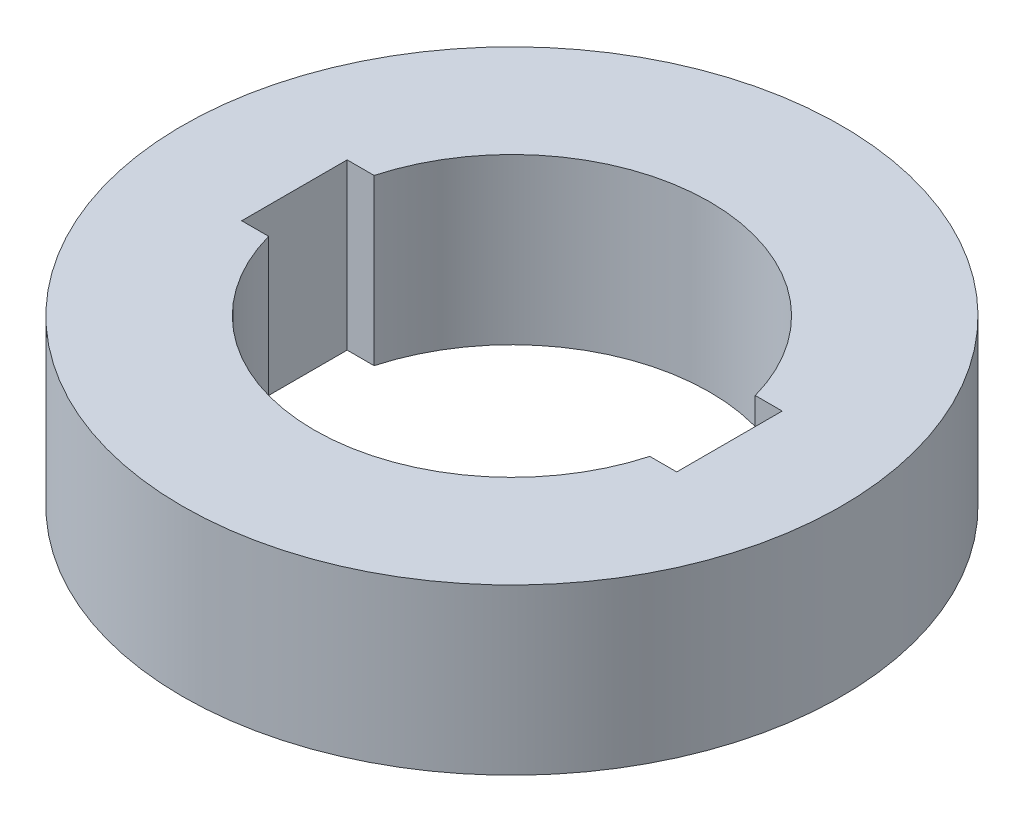
ISO-10303-21;
HEADER;
FILE_DESCRIPTION(('STEP AP214'),'2;1');
FILE_NAME('part.step','',(''),(''),'','','');
FILE_SCHEMA(('AUTOMOTIVE_DESIGN { 1 0 10303 214 1 1 1 1 }'));
ENDSEC;
DATA;
#1=APPLICATION_CONTEXT('core data for automotive mechanical design processes');
#2=APPLICATION_PROTOCOL_DEFINITION('international standard','automotive_design',2000,#1);
#3=PRODUCT_CONTEXT('',#1,'mechanical');
#4=PRODUCT('Part','Part','',(#3));
#5=PRODUCT_RELATED_PRODUCT_CATEGORY('part','',(#4));
#6=PRODUCT_DEFINITION_FORMATION('','',#4);
#7=PRODUCT_DEFINITION_CONTEXT('part definition',#1,'design');
#8=PRODUCT_DEFINITION('design','',#6,#7);
#9=PRODUCT_DEFINITION_SHAPE('','',#8);
#10=(LENGTH_UNIT() NAMED_UNIT(*) SI_UNIT(.MILLI.,.METRE.));
#11=(NAMED_UNIT(*) PLANE_ANGLE_UNIT() SI_UNIT($,.RADIAN.));
#12=(NAMED_UNIT(*) SI_UNIT($,.STERADIAN.) SOLID_ANGLE_UNIT());
#13=UNCERTAINTY_MEASURE_WITH_UNIT(LENGTH_MEASURE(1.E-05),#10,'distance_accuracy_value','');
#14=(GEOMETRIC_REPRESENTATION_CONTEXT(3) GLOBAL_UNCERTAINTY_ASSIGNED_CONTEXT((#13)) GLOBAL_UNIT_ASSIGNED_CONTEXT((#10,
#11,#12)) REPRESENTATION_CONTEXT('',''));
#15=CARTESIAN_POINT('',(0.,0.,0.));
#16=DIRECTION('',(0.,0.,1.));
#17=DIRECTION('',(1.,0.,0.));
#18=AXIS2_PLACEMENT_3D('',#15,#16,#17);
#19=CARTESIAN_POINT('',(0.,25.,0.));
#20=DIRECTION('',(0.,-1.,0.));
#21=DIRECTION('',(0.,0.,-1.));
#22=AXIS2_PLACEMENT_3D('',#19,#20,#21);
#23=CYLINDRICAL_SURFACE('',#22,50.);
#24=CARTESIAN_POINT('',(0.,25.,0.));
#25=DIRECTION('',(0.,1.,0.));
#26=DIRECTION('',(0.,0.,1.));
#27=AXIS2_PLACEMENT_3D('',#24,#25,#26);
#28=CIRCLE('',#27,50.);
#29=CARTESIAN_POINT('',(0.,25.,50.));
#30=VERTEX_POINT('',#29);
#31=EDGE_CURVE('E11',#30,#30,#28,.T.);
#32=ORIENTED_EDGE('',*,*,#31,.F.);
#33=EDGE_LOOP('',(#32));
#34=FACE_BOUND('',#33,.T.);
#35=CARTESIAN_POINT('',(0.,0.,0.));
#36=DIRECTION('',(0.,1.,0.));
#37=DIRECTION('',(0.,0.,1.));
#38=AXIS2_PLACEMENT_3D('',#35,#36,#37);
#39=CIRCLE('',#38,50.);
#40=CARTESIAN_POINT('',(0.,0.,50.));
#41=VERTEX_POINT('',#40);
#42=EDGE_CURVE('E42',#41,#41,#39,.T.);
#43=ORIENTED_EDGE('',*,*,#42,.T.);
#44=EDGE_LOOP('',(#43));
#45=FACE_BOUND('',#44,.T.);
#46=ADVANCED_FACE('F39',(#34,#45),#23,.T.);
#47=CARTESIAN_POINT('',(0.,25.,0.));
#48=DIRECTION('',(0.,1.,0.));
#49=DIRECTION('',(0.,0.,1.));
#50=AXIS2_PLACEMENT_3D('',#47,#48,#49);
#51=PLANE('',#50);
#52=CARTESIAN_POINT('',(0.,25.,0.));
#53=DIRECTION('',(0.,1.,0.));
#54=DIRECTION('',(0.,0.,1.));
#55=AXIS2_PLACEMENT_3D('',#52,#53,#54);
#56=CIRCLE('',#55,30.);
#57=CARTESIAN_POINT('',(28.9136645896019,25.,-8.));
#58=VERTEX_POINT('',#57);
#59=CARTESIAN_POINT('',(-28.9136645896019,25.,-7.99999999999999));
#60=VERTEX_POINT('',#59);
#61=EDGE_CURVE('E53',#58,#60,#56,.T.);
#62=ORIENTED_EDGE('',*,*,#61,.F.);
#63=DIRECTION('',(-1.,0.,0.));
#64=VECTOR('',#63,1.);
#65=CARTESIAN_POINT('',(33.,25.,-8.));
#66=LINE('',#65,#64);
#67=CARTESIAN_POINT('',(33.,25.,-8.));
#68=VERTEX_POINT('',#67);
#69=EDGE_CURVE('E122',#68,#58,#66,.T.);
#70=ORIENTED_EDGE('',*,*,#69,.F.);
#71=DIRECTION('',(0.,0.,-1.));
#72=VECTOR('',#71,1.);
#73=CARTESIAN_POINT('',(33.,25.,-8.));
#74=LINE('',#73,#72);
#75=CARTESIAN_POINT('',(33.,25.,8.));
#76=VERTEX_POINT('',#75);
#77=EDGE_CURVE('E125',#76,#68,#74,.T.);
#78=ORIENTED_EDGE('',*,*,#77,.F.);
#79=DIRECTION('',(1.,0.,0.));
#80=VECTOR('',#79,1.);
#81=CARTESIAN_POINT('',(33.,25.,8.));
#82=LINE('',#81,#80);
#83=CARTESIAN_POINT('',(28.9136645896019,25.,8.));
#84=VERTEX_POINT('',#83);
#85=EDGE_CURVE('E153',#84,#76,#82,.T.);
#86=ORIENTED_EDGE('',*,*,#85,.F.);
#87=CARTESIAN_POINT('',(0.,25.,0.));
#88=DIRECTION('',(0.,1.,0.));
#89=DIRECTION('',(0.,0.,1.));
#90=AXIS2_PLACEMENT_3D('',#87,#88,#89);
#91=CIRCLE('',#90,30.);
#92=CARTESIAN_POINT('',(-28.9136645896019,25.,8.));
#93=VERTEX_POINT('',#92);
#94=EDGE_CURVE('E150',#93,#84,#91,.T.);
#95=ORIENTED_EDGE('',*,*,#94,.F.);
#96=DIRECTION('',(1.,0.,0.));
#97=VECTOR('',#96,1.);
#98=CARTESIAN_POINT('',(-33.,25.,8.00000000000001));
#99=LINE('',#98,#97);
#100=CARTESIAN_POINT('',(-33.,25.,8.00000000000001));
#101=VERTEX_POINT('',#100);
#102=EDGE_CURVE('E147',#101,#93,#99,.T.);
#103=ORIENTED_EDGE('',*,*,#102,.F.);
#104=DIRECTION('',(0.,0.,1.));
#105=VECTOR('',#104,1.);
#106=CARTESIAN_POINT('',(-33.,25.,-7.99999999999999));
#107=LINE('',#106,#105);
#108=CARTESIAN_POINT('',(-33.,25.,-7.99999999999999));
#109=VERTEX_POINT('',#108);
#110=EDGE_CURVE('E144',#109,#101,#107,.T.);
#111=ORIENTED_EDGE('',*,*,#110,.F.);
#112=DIRECTION('',(-1.,0.,0.));
#113=VECTOR('',#112,1.);
#114=CARTESIAN_POINT('',(-33.,25.,-7.99999999999999));
#115=LINE('',#114,#113);
#116=EDGE_CURVE('E142',#60,#109,#115,.T.);
#117=ORIENTED_EDGE('',*,*,#116,.F.);
#118=EDGE_LOOP('',(#62,#70,#78,#86,#95,#103,#111,#117));
#119=FACE_BOUND('',#118,.T.);
#120=ORIENTED_EDGE('',*,*,#31,.T.);
#121=EDGE_LOOP('',(#120));
#122=FACE_BOUND('',#121,.T.);
#123=ADVANCED_FACE('F174',(#119,#122),#51,.T.);
#124=CARTESIAN_POINT('',(0.,0.,0.));
#125=DIRECTION('',(0.,1.,0.));
#126=DIRECTION('',(0.,0.,1.));
#127=AXIS2_PLACEMENT_3D('',#124,#125,#126);
#128=PLANE('',#127);
#129=DIRECTION('',(-1.,0.,0.));
#130=VECTOR('',#129,1.);
#131=CARTESIAN_POINT('',(33.,0.,-8.));
#132=LINE('',#131,#130);
#133=CARTESIAN_POINT('',(33.,0.,-8.));
#134=VERTEX_POINT('',#133);
#135=CARTESIAN_POINT('',(28.9136645896019,0.,-8.));
#136=VERTEX_POINT('',#135);
#137=EDGE_CURVE('E111',#134,#136,#132,.T.);
#138=ORIENTED_EDGE('',*,*,#137,.T.);
#139=CARTESIAN_POINT('',(0.,0.,0.));
#140=DIRECTION('',(0.,1.,0.));
#141=DIRECTION('',(0.,0.,1.));
#142=AXIS2_PLACEMENT_3D('',#139,#140,#141);
#143=CIRCLE('',#142,30.);
#144=CARTESIAN_POINT('',(-28.9136645896019,0.,-7.99999999999999));
#145=VERTEX_POINT('',#144);
#146=EDGE_CURVE('E105',#136,#145,#143,.T.);
#147=ORIENTED_EDGE('',*,*,#146,.T.);
#148=DIRECTION('',(-1.,0.,0.));
#149=VECTOR('',#148,1.);
#150=CARTESIAN_POINT('',(-33.,0.,-7.99999999999999));
#151=LINE('',#150,#149);
#152=CARTESIAN_POINT('',(-33.,0.,-7.99999999999999));
#153=VERTEX_POINT('',#152);
#154=EDGE_CURVE('E114',#145,#153,#151,.T.);
#155=ORIENTED_EDGE('',*,*,#154,.T.);
#156=DIRECTION('',(0.,0.,1.));
#157=VECTOR('',#156,1.);
#158=CARTESIAN_POINT('',(-33.,0.,-7.99999999999999));
#159=LINE('',#158,#157);
#160=CARTESIAN_POINT('',(-33.,0.,8.00000000000001));
#161=VERTEX_POINT('',#160);
#162=EDGE_CURVE('E61',#153,#161,#159,.T.);
#163=ORIENTED_EDGE('',*,*,#162,.T.);
#164=DIRECTION('',(1.,0.,0.));
#165=VECTOR('',#164,1.);
#166=CARTESIAN_POINT('',(-33.,0.,8.00000000000001));
#167=LINE('',#166,#165);
#168=CARTESIAN_POINT('',(-28.9136645896019,0.,8.));
#169=VERTEX_POINT('',#168);
#170=EDGE_CURVE('E129',#161,#169,#167,.T.);
#171=ORIENTED_EDGE('',*,*,#170,.T.);
#172=CARTESIAN_POINT('',(0.,0.,0.));
#173=DIRECTION('',(0.,1.,0.));
#174=DIRECTION('',(0.,0.,1.));
#175=AXIS2_PLACEMENT_3D('',#172,#173,#174);
#176=CIRCLE('',#175,30.);
#177=CARTESIAN_POINT('',(28.9136645896019,0.,8.));
#178=VERTEX_POINT('',#177);
#179=EDGE_CURVE('E132',#169,#178,#176,.T.);
#180=ORIENTED_EDGE('',*,*,#179,.T.);
#181=DIRECTION('',(1.,0.,0.));
#182=VECTOR('',#181,1.);
#183=CARTESIAN_POINT('',(33.,0.,8.));
#184=LINE('',#183,#182);
#185=CARTESIAN_POINT('',(33.,0.,8.));
#186=VERTEX_POINT('',#185);
#187=EDGE_CURVE('E135',#178,#186,#184,.T.);
#188=ORIENTED_EDGE('',*,*,#187,.T.);
#189=DIRECTION('',(0.,0.,-1.));
#190=VECTOR('',#189,1.);
#191=CARTESIAN_POINT('',(33.,0.,-8.));
#192=LINE('',#191,#190);
#193=EDGE_CURVE('E138',#186,#134,#192,.T.);
#194=ORIENTED_EDGE('',*,*,#193,.T.);
#195=EDGE_LOOP('',(#138,#147,#155,#163,#171,#180,#188,#194));
#196=FACE_BOUND('',#195,.T.);
#197=ORIENTED_EDGE('',*,*,#42,.F.);
#198=EDGE_LOOP('',(#197));
#199=FACE_BOUND('',#198,.T.);
#200=ADVANCED_FACE('F118',(#196,#199),#128,.F.);
#201=CARTESIAN_POINT('',(0.,0.,0.));
#202=DIRECTION('',(0.,1.,0.));
#203=DIRECTION('',(0.,0.,1.));
#204=AXIS2_PLACEMENT_3D('',#201,#202,#203);
#205=CYLINDRICAL_SURFACE('',#204,30.);
#206=ORIENTED_EDGE('',*,*,#61,.T.);
#207=DIRECTION('',(0.,1.,0.));
#208=VECTOR('',#207,1.);
#209=CARTESIAN_POINT('',(-28.9136645896019,0.,-7.99999999999999));
#210=LINE('',#209,#208);
#211=EDGE_CURVE('E101',#145,#60,#210,.T.);
#212=ORIENTED_EDGE('',*,*,#211,.F.);
#213=ORIENTED_EDGE('',*,*,#146,.F.);
#214=DIRECTION('',(0.,1.,0.));
#215=VECTOR('',#214,1.);
#216=CARTESIAN_POINT('',(28.9136645896019,0.,-8.));
#217=LINE('',#216,#215);
#218=EDGE_CURVE('E158',#136,#58,#217,.T.);
#219=ORIENTED_EDGE('',*,*,#218,.T.);
#220=EDGE_LOOP('',(#206,#212,#213,#219));
#221=FACE_BOUND('',#220,.T.);
#222=ADVANCED_FACE('F103',(#221),#205,.F.);
#223=CARTESIAN_POINT('',(33.,0.,-8.));
#224=DIRECTION('',(0.,0.,-1.));
#225=DIRECTION('',(-1.,0.,0.));
#226=AXIS2_PLACEMENT_3D('',#223,#224,#225);
#227=PLANE('',#226);
#228=ORIENTED_EDGE('',*,*,#69,.T.);
#229=ORIENTED_EDGE('',*,*,#218,.F.);
#230=ORIENTED_EDGE('',*,*,#137,.F.);
#231=DIRECTION('',(0.,1.,0.));
#232=VECTOR('',#231,1.);
#233=CARTESIAN_POINT('',(33.,0.,-8.));
#234=LINE('',#233,#232);
#235=EDGE_CURVE('E160',#134,#68,#234,.T.);
#236=ORIENTED_EDGE('',*,*,#235,.T.);
#237=EDGE_LOOP('',(#228,#229,#230,#236));
#238=FACE_BOUND('',#237,.T.);
#239=ADVANCED_FACE('F193',(#238),#227,.F.);
#240=CARTESIAN_POINT('',(33.,0.,-8.));
#241=DIRECTION('',(1.,0.,0.));
#242=DIRECTION('',(0.,0.,-1.));
#243=AXIS2_PLACEMENT_3D('',#240,#241,#242);
#244=PLANE('',#243);
#245=ORIENTED_EDGE('',*,*,#77,.T.);
#246=ORIENTED_EDGE('',*,*,#235,.F.);
#247=ORIENTED_EDGE('',*,*,#193,.F.);
#248=DIRECTION('',(0.,1.,0.));
#249=VECTOR('',#248,1.);
#250=CARTESIAN_POINT('',(33.,0.,8.));
#251=LINE('',#250,#249);
#252=EDGE_CURVE('E162',#186,#76,#251,.T.);
#253=ORIENTED_EDGE('',*,*,#252,.T.);
#254=EDGE_LOOP('',(#245,#246,#247,#253));
#255=FACE_BOUND('',#254,.T.);
#256=ADVANCED_FACE('F190',(#255),#244,.F.);
#257=CARTESIAN_POINT('',(33.,0.,8.));
#258=DIRECTION('',(0.,0.,1.));
#259=DIRECTION('',(1.,0.,0.));
#260=AXIS2_PLACEMENT_3D('',#257,#258,#259);
#261=PLANE('',#260);
#262=ORIENTED_EDGE('',*,*,#85,.T.);
#263=ORIENTED_EDGE('',*,*,#252,.F.);
#264=ORIENTED_EDGE('',*,*,#187,.F.);
#265=DIRECTION('',(0.,1.,0.));
#266=VECTOR('',#265,1.);
#267=CARTESIAN_POINT('',(28.9136645896019,0.,8.));
#268=LINE('',#267,#266);
#269=EDGE_CURVE('E164',#178,#84,#268,.T.);
#270=ORIENTED_EDGE('',*,*,#269,.T.);
#271=EDGE_LOOP('',(#262,#263,#264,#270));
#272=FACE_BOUND('',#271,.T.);
#273=ADVANCED_FACE('F186',(#272),#261,.F.);
#274=CARTESIAN_POINT('',(0.,0.,0.));
#275=DIRECTION('',(0.,1.,0.));
#276=DIRECTION('',(0.,0.,1.));
#277=AXIS2_PLACEMENT_3D('',#274,#275,#276);
#278=CYLINDRICAL_SURFACE('',#277,30.);
#279=ORIENTED_EDGE('',*,*,#94,.T.);
#280=ORIENTED_EDGE('',*,*,#269,.F.);
#281=ORIENTED_EDGE('',*,*,#179,.F.);
#282=DIRECTION('',(0.,1.,0.));
#283=VECTOR('',#282,1.);
#284=CARTESIAN_POINT('',(-28.9136645896019,0.,8.));
#285=LINE('',#284,#283);
#286=EDGE_CURVE('E166',#169,#93,#285,.T.);
#287=ORIENTED_EDGE('',*,*,#286,.T.);
#288=EDGE_LOOP('',(#279,#280,#281,#287));
#289=FACE_BOUND('',#288,.T.);
#290=ADVANCED_FACE('F184',(#289),#278,.F.);
#291=CARTESIAN_POINT('',(-33.,0.,8.00000000000001));
#292=DIRECTION('',(0.,0.,1.));
#293=DIRECTION('',(1.,0.,0.));
#294=AXIS2_PLACEMENT_3D('',#291,#292,#293);
#295=PLANE('',#294);
#296=ORIENTED_EDGE('',*,*,#102,.T.);
#297=ORIENTED_EDGE('',*,*,#286,.F.);
#298=ORIENTED_EDGE('',*,*,#170,.F.);
#299=DIRECTION('',(0.,1.,0.));
#300=VECTOR('',#299,1.);
#301=CARTESIAN_POINT('',(-33.,0.,8.00000000000001));
#302=LINE('',#301,#300);
#303=EDGE_CURVE('E168',#161,#101,#302,.T.);
#304=ORIENTED_EDGE('',*,*,#303,.T.);
#305=EDGE_LOOP('',(#296,#297,#298,#304));
#306=FACE_BOUND('',#305,.T.);
#307=ADVANCED_FACE('F179',(#306),#295,.F.);
#308=CARTESIAN_POINT('',(-33.,0.,-7.99999999999999));
#309=DIRECTION('',(-1.,0.,0.));
#310=DIRECTION('',(0.,0.,1.));
#311=AXIS2_PLACEMENT_3D('',#308,#309,#310);
#312=PLANE('',#311);
#313=ORIENTED_EDGE('',*,*,#110,.T.);
#314=ORIENTED_EDGE('',*,*,#303,.F.);
#315=ORIENTED_EDGE('',*,*,#162,.F.);
#316=DIRECTION('',(0.,1.,0.));
#317=VECTOR('',#316,1.);
#318=CARTESIAN_POINT('',(-33.,0.,-7.99999999999999));
#319=LINE('',#318,#317);
#320=EDGE_CURVE('E110',#153,#109,#319,.T.);
#321=ORIENTED_EDGE('',*,*,#320,.T.);
#322=EDGE_LOOP('',(#313,#314,#315,#321));
#323=FACE_BOUND('',#322,.T.);
#324=ADVANCED_FACE('F170',(#323),#312,.F.);
#325=CARTESIAN_POINT('',(-33.,0.,-7.99999999999999));
#326=DIRECTION('',(0.,0.,-1.));
#327=DIRECTION('',(-1.,0.,0.));
#328=AXIS2_PLACEMENT_3D('',#325,#326,#327);
#329=PLANE('',#328);
#330=ORIENTED_EDGE('',*,*,#116,.T.);
#331=ORIENTED_EDGE('',*,*,#320,.F.);
#332=ORIENTED_EDGE('',*,*,#154,.F.);
#333=ORIENTED_EDGE('',*,*,#211,.T.);
#334=EDGE_LOOP('',(#330,#331,#332,#333));
#335=FACE_BOUND('',#334,.T.);
#336=ADVANCED_FACE('F115',(#335),#329,.F.);
#337=CLOSED_SHELL('',(#46,#123,#200,#222,#239,#256,#273,#290,#307,#324,#336));
#338=MANIFOLD_SOLID_BREP('B2',#337);
#339=ADVANCED_BREP_SHAPE_REPRESENTATION('',(#18,#338),#14);
#340=SHAPE_DEFINITION_REPRESENTATION(#9,#339);
ENDSEC;
END-ISO-10303-21;
